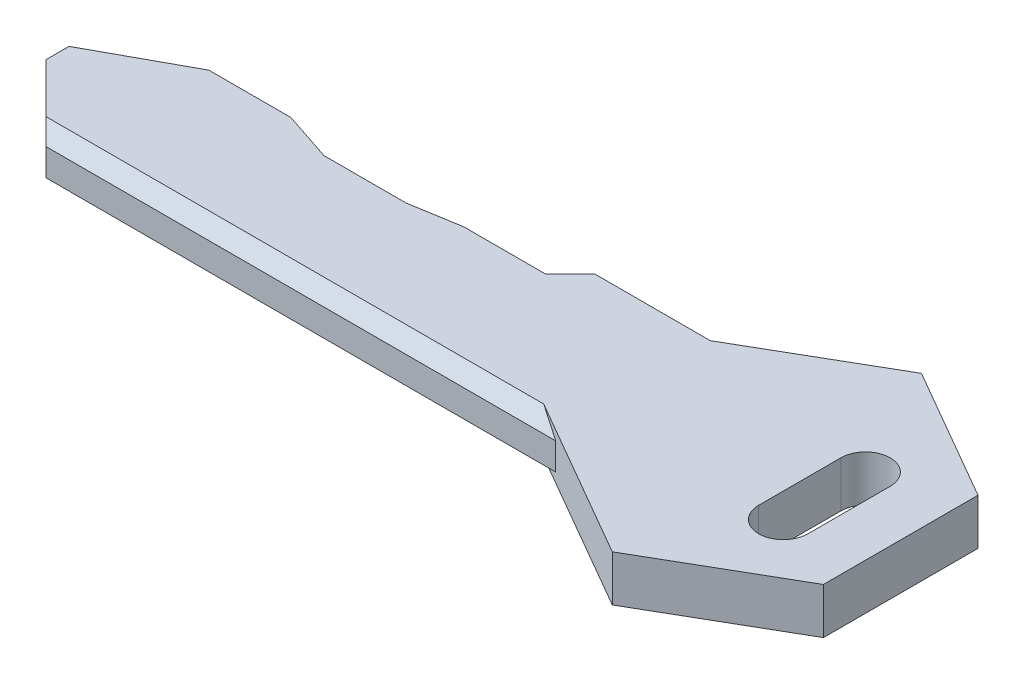
ISO-10303-21;
HEADER;
FILE_DESCRIPTION(('STEP AP214'),'2;1');
FILE_NAME('part.step','',(''),(''),'','','');
FILE_SCHEMA(('AUTOMOTIVE_DESIGN { 1 0 10303 214 1 1 1 1 }'));
ENDSEC;
DATA;
#1=APPLICATION_CONTEXT('core data for automotive mechanical design processes');
#2=APPLICATION_PROTOCOL_DEFINITION('international standard','automotive_design',2000,#1);
#3=PRODUCT_CONTEXT('',#1,'mechanical');
#4=PRODUCT('Part','Part','',(#3));
#5=PRODUCT_RELATED_PRODUCT_CATEGORY('part','',(#4));
#6=PRODUCT_DEFINITION_FORMATION('','',#4);
#7=PRODUCT_DEFINITION_CONTEXT('part definition',#1,'design');
#8=PRODUCT_DEFINITION('design','',#6,#7);
#9=PRODUCT_DEFINITION_SHAPE('','',#8);
#10=(LENGTH_UNIT() NAMED_UNIT(*) SI_UNIT(.MILLI.,.METRE.));
#11=(NAMED_UNIT(*) PLANE_ANGLE_UNIT() SI_UNIT($,.RADIAN.));
#12=(NAMED_UNIT(*) SI_UNIT($,.STERADIAN.) SOLID_ANGLE_UNIT());
#13=UNCERTAINTY_MEASURE_WITH_UNIT(LENGTH_MEASURE(1.E-05),#10,'distance_accuracy_value','');
#14=(GEOMETRIC_REPRESENTATION_CONTEXT(3) GLOBAL_UNCERTAINTY_ASSIGNED_CONTEXT((#13)) GLOBAL_UNIT_ASSIGNED_CONTEXT((#10,
#11,#12)) REPRESENTATION_CONTEXT('',''));
#15=CARTESIAN_POINT('',(0.,0.,0.));
#16=DIRECTION('',(0.,0.,1.));
#17=DIRECTION('',(1.,0.,0.));
#18=AXIS2_PLACEMENT_3D('',#15,#16,#17);
#19=CARTESIAN_POINT('',(46.6406387955737,2.8,-2.2));
#20=DIRECTION('',(0.,-1.,0.));
#21=DIRECTION('',(0.,0.,-1.));
#22=AXIS2_PLACEMENT_3D('',#19,#20,#21);
#23=CYLINDRICAL_SURFACE('',#22,1.5);
#24=CARTESIAN_POINT('',(46.6406387955737,0.,-2.2));
#25=DIRECTION('',(0.,1.,0.));
#26=DIRECTION('',(0.,0.,1.));
#27=AXIS2_PLACEMENT_3D('',#24,#25,#26);
#28=CIRCLE('',#27,1.5);
#29=CARTESIAN_POINT('',(45.1406387955737,0.,-2.2));
#30=VERTEX_POINT('',#29);
#31=CARTESIAN_POINT('',(48.1406387955737,0.,-2.2));
#32=VERTEX_POINT('',#31);
#33=EDGE_CURVE('E332',#30,#32,#28,.T.);
#34=ORIENTED_EDGE('',*,*,#33,.F.);
#35=DIRECTION('',(0.,-1.,0.));
#36=VECTOR('',#35,1.);
#37=CARTESIAN_POINT('',(45.1406387955737,2.8,-2.2));
#38=LINE('',#37,#36);
#39=CARTESIAN_POINT('',(45.1406387955737,2.8,-2.2));
#40=VERTEX_POINT('',#39);
#41=EDGE_CURVE('E350',#40,#30,#38,.T.);
#42=ORIENTED_EDGE('',*,*,#41,.F.);
#43=CARTESIAN_POINT('',(46.6406387955737,2.8,-2.2));
#44=DIRECTION('',(0.,1.,0.));
#45=DIRECTION('',(0.,0.,1.));
#46=AXIS2_PLACEMENT_3D('',#43,#44,#45);
#47=CIRCLE('',#46,1.5);
#48=CARTESIAN_POINT('',(48.1406387955737,2.8,-2.2));
#49=VERTEX_POINT('',#48);
#50=EDGE_CURVE('E308',#40,#49,#47,.T.);
#51=ORIENTED_EDGE('',*,*,#50,.T.);
#52=DIRECTION('',(0.,-1.,0.));
#53=VECTOR('',#52,1.);
#54=CARTESIAN_POINT('',(48.1406387955737,2.8,-2.2));
#55=LINE('',#54,#53);
#56=EDGE_CURVE('E343',#49,#32,#55,.T.);
#57=ORIENTED_EDGE('',*,*,#56,.T.);
#58=EDGE_LOOP('',(#34,#42,#51,#57));
#59=FACE_BOUND('',#58,.T.);
#60=ADVANCED_FACE('F34',(#59),#23,.F.);
#61=CARTESIAN_POINT('',(45.1406387955737,2.8,0.));
#62=DIRECTION('',(1.,0.,0.));
#63=DIRECTION('',(0.,0.,-1.));
#64=AXIS2_PLACEMENT_3D('',#61,#62,#63);
#65=PLANE('',#64);
#66=DIRECTION('',(0.,0.,1.));
#67=VECTOR('',#66,1.);
#68=CARTESIAN_POINT('',(45.1406387955737,0.,0.));
#69=LINE('',#68,#67);
#70=CARTESIAN_POINT('',(45.1406387955737,0.,-7.2));
#71=VERTEX_POINT('',#70);
#72=EDGE_CURVE('E335',#71,#30,#69,.T.);
#73=ORIENTED_EDGE('',*,*,#72,.F.);
#74=DIRECTION('',(0.,-1.,0.));
#75=VECTOR('',#74,1.);
#76=CARTESIAN_POINT('',(45.1406387955737,2.8,-7.2));
#77=LINE('',#76,#75);
#78=CARTESIAN_POINT('',(45.1406387955737,2.8,-7.2));
#79=VERTEX_POINT('',#78);
#80=EDGE_CURVE('E348',#79,#71,#77,.T.);
#81=ORIENTED_EDGE('',*,*,#80,.F.);
#82=DIRECTION('',(0.,0.,1.));
#83=VECTOR('',#82,1.);
#84=CARTESIAN_POINT('',(45.1406387955737,2.8,0.));
#85=LINE('',#84,#83);
#86=EDGE_CURVE('E311',#79,#40,#85,.T.);
#87=ORIENTED_EDGE('',*,*,#86,.T.);
#88=ORIENTED_EDGE('',*,*,#41,.T.);
#89=EDGE_LOOP('',(#73,#81,#87,#88));
#90=FACE_BOUND('',#89,.T.);
#91=ADVANCED_FACE('F488',(#90),#65,.T.);
#92=CARTESIAN_POINT('',(46.6406387955737,2.8,-7.2));
#93=DIRECTION('',(0.,-1.,0.));
#94=DIRECTION('',(0.,0.,-1.));
#95=AXIS2_PLACEMENT_3D('',#92,#93,#94);
#96=CYLINDRICAL_SURFACE('',#95,1.5);
#97=CARTESIAN_POINT('',(46.6406387955737,0.,-7.2));
#98=DIRECTION('',(0.,1.,0.));
#99=DIRECTION('',(0.,0.,1.));
#100=AXIS2_PLACEMENT_3D('',#97,#98,#99);
#101=CIRCLE('',#100,1.5);
#102=CARTESIAN_POINT('',(48.1406387955737,0.,-7.2));
#103=VERTEX_POINT('',#102);
#104=EDGE_CURVE('E338',#103,#71,#101,.T.);
#105=ORIENTED_EDGE('',*,*,#104,.F.);
#106=DIRECTION('',(0.,-1.,0.));
#107=VECTOR('',#106,1.);
#108=CARTESIAN_POINT('',(48.1406387955737,2.8,-7.2));
#109=LINE('',#108,#107);
#110=CARTESIAN_POINT('',(48.1406387955737,2.8,-7.2));
#111=VERTEX_POINT('',#110);
#112=EDGE_CURVE('E345',#111,#103,#109,.T.);
#113=ORIENTED_EDGE('',*,*,#112,.F.);
#114=CARTESIAN_POINT('',(46.6406387955737,2.8,-7.2));
#115=DIRECTION('',(0.,1.,0.));
#116=DIRECTION('',(0.,0.,1.));
#117=AXIS2_PLACEMENT_3D('',#114,#115,#116);
#118=CIRCLE('',#117,1.5);
#119=EDGE_CURVE('E314',#111,#79,#118,.T.);
#120=ORIENTED_EDGE('',*,*,#119,.T.);
#121=ORIENTED_EDGE('',*,*,#80,.T.);
#122=EDGE_LOOP('',(#105,#113,#120,#121));
#123=FACE_BOUND('',#122,.T.);
#124=ADVANCED_FACE('F494',(#123),#96,.F.);
#125=CARTESIAN_POINT('',(0.,2.8,0.));
#126=DIRECTION('',(0.,0.,-1.));
#127=DIRECTION('',(-1.,0.,0.));
#128=AXIS2_PLACEMENT_3D('',#125,#126,#127);
#129=PLANE('',#128);
#130=DIRECTION('',(0.,-1.,0.));
#131=VECTOR('',#130,1.);
#132=CARTESIAN_POINT('',(35.,2.8,0.));
#133=LINE('',#132,#131);
#134=CARTESIAN_POINT('',(35.,2.22264973081037,0.));
#135=VERTEX_POINT('',#134);
#136=CARTESIAN_POINT('',(35.,0.577350269189626,0.));
#137=VERTEX_POINT('',#136);
#138=EDGE_CURVE('E346',#135,#137,#133,.T.);
#139=ORIENTED_EDGE('',*,*,#138,.F.);
#140=DIRECTION('',(-1.,0.,0.));
#141=VECTOR('',#140,1.);
#142=CARTESIAN_POINT('',(4.00000000000007,2.22264973081037,0.));
#143=LINE('',#142,#141);
#144=CARTESIAN_POINT('',(4.00000000000007,2.22264973081037,0.));
#145=VERTEX_POINT('',#144);
#146=EDGE_CURVE('E394',#135,#145,#143,.T.);
#147=ORIENTED_EDGE('',*,*,#146,.T.);
#148=DIRECTION('',(0.,-1.,0.));
#149=VECTOR('',#148,1.);
#150=CARTESIAN_POINT('',(4.00000000000007,0.,0.));
#151=LINE('',#150,#149);
#152=CARTESIAN_POINT('',(4.00000000000007,0.577350269189626,0.));
#153=VERTEX_POINT('',#152);
#154=EDGE_CURVE('E352',#145,#153,#151,.T.);
#155=ORIENTED_EDGE('',*,*,#154,.T.);
#156=DIRECTION('',(1.,0.,0.));
#157=VECTOR('',#156,1.);
#158=CARTESIAN_POINT('',(0.,0.577350269189626,0.));
#159=LINE('',#158,#157);
#160=EDGE_CURVE('E380',#153,#137,#159,.T.);
#161=ORIENTED_EDGE('',*,*,#160,.T.);
#162=EDGE_LOOP('',(#139,#147,#155,#161));
#163=FACE_BOUND('',#162,.T.);
#164=ADVANCED_FACE('F517',(#163),#129,.F.);
#165=CARTESIAN_POINT('',(8.75,2.8,-15.1554445662277));
#166=DIRECTION('',(0.5,0.,-0.866025403784439));
#167=DIRECTION('',(-0.866025403784439,0.,-0.5));
#168=AXIS2_PLACEMENT_3D('',#165,#166,#167);
#169=PLANE('',#168);
#170=DIRECTION('',(0.866025403784439,0.,0.5));
#171=VECTOR('',#170,1.);
#172=CARTESIAN_POINT('',(8.75,0.,-15.1554445662277));
#173=LINE('',#172,#171);
#174=CARTESIAN_POINT('',(33.2679491924311,0.,-1.00000000000001));
#175=VERTEX_POINT('',#174);
#176=CARTESIAN_POINT('',(43.1406387955737,0.,4.7));
#177=VERTEX_POINT('',#176);
#178=EDGE_CURVE('E282',#175,#177,#173,.T.);
#179=ORIENTED_EDGE('',*,*,#178,.T.);
#180=DIRECTION('',(0.,-1.,0.));
#181=VECTOR('',#180,1.);
#182=CARTESIAN_POINT('',(43.1406387955737,2.8,4.7));
#183=LINE('',#182,#181);
#184=CARTESIAN_POINT('',(43.1406387955737,2.8,4.7));
#185=VERTEX_POINT('',#184);
#186=EDGE_CURVE('E364',#185,#177,#183,.T.);
#187=ORIENTED_EDGE('',*,*,#186,.F.);
#188=DIRECTION('',(0.866025403784439,0.,0.5));
#189=VECTOR('',#188,1.);
#190=CARTESIAN_POINT('',(8.75,2.8,-15.1554445662277));
#191=LINE('',#190,#189);
#192=CARTESIAN_POINT('',(33.2679491924311,2.8,-1.));
#193=VERTEX_POINT('',#192);
#194=EDGE_CURVE('E291',#193,#185,#191,.T.);
#195=ORIENTED_EDGE('',*,*,#194,.F.);
#196=DIRECTION('',(0.832050294337844,-0.277350098112613,0.480384461415262));
#197=VECTOR('',#196,1.);
#198=CARTESIAN_POINT('',(10.6359960917254,10.3439843669018,-14.0665642149794));
#199=LINE('',#198,#197);
#200=EDGE_CURVE('E57',#193,#135,#199,.T.);
#201=ORIENTED_EDGE('',*,*,#200,.T.);
#202=ORIENTED_EDGE('',*,*,#138,.T.);
#203=DIRECTION('',(0.832050294337844,0.277350098112613,0.480384461415262));
#204=VECTOR('',#203,1.);
#205=CARTESIAN_POINT('',(11.2821499378793,-7.32859975151722,-13.6935071179646));
#206=LINE('',#205,#204);
#207=EDGE_CURVE('E388',#137,#175,#206,.F.);
#208=ORIENTED_EDGE('',*,*,#207,.T.);
#209=EDGE_LOOP('',(#179,#187,#195,#201,#202,#208));
#210=FACE_BOUND('',#209,.T.);
#211=ADVANCED_FACE('F449',(#210),#169,.F.);
#212=CARTESIAN_POINT('',(12.8203193977869,2.8,22.2054445662277));
#213=DIRECTION('',(-0.5,0.,-0.866025403784439));
#214=DIRECTION('',(-0.866025403784438,0.,0.5));
#215=AXIS2_PLACEMENT_3D('',#212,#213,#214);
#216=PLANE('',#215);
#217=DIRECTION('',(0.866025403784439,0.,-0.5));
#218=VECTOR('',#217,1.);
#219=CARTESIAN_POINT('',(12.8203193977869,0.,22.2054445662277));
#220=LINE('',#219,#218);
#221=CARTESIAN_POINT('',(51.2812775911475,0.,0.));
#222=VERTEX_POINT('',#221);
#223=EDGE_CURVE('E321',#177,#222,#220,.T.);
#224=ORIENTED_EDGE('',*,*,#223,.T.);
#225=DIRECTION('',(0.,-1.,0.));
#226=VECTOR('',#225,1.);
#227=CARTESIAN_POINT('',(51.2812775911475,2.8,0.));
#228=LINE('',#227,#226);
#229=CARTESIAN_POINT('',(51.2812775911475,2.8,0.));
#230=VERTEX_POINT('',#229);
#231=EDGE_CURVE('E361',#230,#222,#228,.T.);
#232=ORIENTED_EDGE('',*,*,#231,.F.);
#233=DIRECTION('',(0.866025403784439,0.,-0.5));
#234=VECTOR('',#233,1.);
#235=CARTESIAN_POINT('',(12.8203193977869,2.8,22.2054445662277));
#236=LINE('',#235,#234);
#237=EDGE_CURVE('E293',#185,#230,#236,.T.);
#238=ORIENTED_EDGE('',*,*,#237,.F.);
#239=ORIENTED_EDGE('',*,*,#186,.T.);
#240=EDGE_LOOP('',(#224,#232,#238,#239));
#241=FACE_BOUND('',#240,.T.);
#242=ADVANCED_FACE('F446',(#241),#216,.F.);
#243=CARTESIAN_POINT('',(51.2812775911475,2.8,0.));
#244=DIRECTION('',(-1.,0.,0.));
#245=DIRECTION('',(0.,0.,1.));
#246=AXIS2_PLACEMENT_3D('',#243,#244,#245);
#247=PLANE('',#246);
#248=DIRECTION('',(0.,0.,-1.));
#249=VECTOR('',#248,1.);
#250=CARTESIAN_POINT('',(51.2812775911475,0.,0.));
#251=LINE('',#250,#249);
#252=CARTESIAN_POINT('',(51.2812775911475,0.,-9.40000000000001));
#253=VERTEX_POINT('',#252);
#254=EDGE_CURVE('E323',#222,#253,#251,.T.);
#255=ORIENTED_EDGE('',*,*,#254,.T.);
#256=DIRECTION('',(0.,-1.,0.));
#257=VECTOR('',#256,1.);
#258=CARTESIAN_POINT('',(51.2812775911475,2.8,-9.40000000000001));
#259=LINE('',#258,#257);
#260=CARTESIAN_POINT('',(51.2812775911475,2.8,-9.40000000000001));
#261=VERTEX_POINT('',#260);
#262=EDGE_CURVE('E358',#261,#253,#259,.T.);
#263=ORIENTED_EDGE('',*,*,#262,.F.);
#264=DIRECTION('',(0.,0.,-1.));
#265=VECTOR('',#264,1.);
#266=CARTESIAN_POINT('',(51.2812775911475,2.8,0.));
#267=LINE('',#266,#265);
#268=EDGE_CURVE('E296',#230,#261,#267,.T.);
#269=ORIENTED_EDGE('',*,*,#268,.F.);
#270=ORIENTED_EDGE('',*,*,#231,.T.);
#271=EDGE_LOOP('',(#255,#263,#269,#270));
#272=FACE_BOUND('',#271,.T.);
#273=ADVANCED_FACE('F442',(#272),#247,.F.);
#274=CARTESIAN_POINT('',(16.8906387955737,2.8,-29.2554445662277));
#275=DIRECTION('',(-0.5,0.,0.866025403784439));
#276=DIRECTION('',(0.866025403784439,0.,0.5));
#277=AXIS2_PLACEMENT_3D('',#274,#275,#276);
#278=PLANE('',#277);
#279=DIRECTION('',(-0.866025403784439,0.,-0.5));
#280=VECTOR('',#279,1.);
#281=CARTESIAN_POINT('',(16.8906387955737,0.,-29.2554445662277));
#282=LINE('',#281,#280);
#283=CARTESIAN_POINT('',(43.1406387955737,0.,-14.1));
#284=VERTEX_POINT('',#283);
#285=EDGE_CURVE('E325',#253,#284,#282,.T.);
#286=ORIENTED_EDGE('',*,*,#285,.T.);
#287=DIRECTION('',(0.,-1.,0.));
#288=VECTOR('',#287,1.);
#289=CARTESIAN_POINT('',(43.1406387955737,2.8,-14.1));
#290=LINE('',#289,#288);
#291=CARTESIAN_POINT('',(43.1406387955737,2.8,-14.1));
#292=VERTEX_POINT('',#291);
#293=EDGE_CURVE('E355',#292,#284,#290,.T.);
#294=ORIENTED_EDGE('',*,*,#293,.F.);
#295=DIRECTION('',(-0.866025403784439,0.,-0.5));
#296=VECTOR('',#295,1.);
#297=CARTESIAN_POINT('',(16.8906387955737,2.8,-29.2554445662277));
#298=LINE('',#297,#296);
#299=EDGE_CURVE('E298',#261,#292,#298,.T.);
#300=ORIENTED_EDGE('',*,*,#299,.F.);
#301=ORIENTED_EDGE('',*,*,#262,.T.);
#302=EDGE_LOOP('',(#286,#294,#300,#301));
#303=FACE_BOUND('',#302,.T.);
#304=ADVANCED_FACE('F438',(#303),#278,.F.);
#305=CARTESIAN_POINT('',(4.67968060221315,2.8,8.10544456622769));
#306=DIRECTION('',(0.5,0.,0.866025403784438));
#307=DIRECTION('',(0.866025403784438,0.,-0.5));
#308=AXIS2_PLACEMENT_3D('',#305,#306,#307);
#309=PLANE('',#308);
#310=DIRECTION('',(-0.866025403784438,0.,0.5));
#311=VECTOR('',#310,1.);
#312=CARTESIAN_POINT('',(4.67968060221315,0.,8.10544456622769));
#313=LINE('',#312,#311);
#314=CARTESIAN_POINT('',(35.,0.,-9.4));
#315=VERTEX_POINT('',#314);
#316=EDGE_CURVE('E327',#284,#315,#313,.T.);
#317=ORIENTED_EDGE('',*,*,#316,.T.);
#318=DIRECTION('',(0.,-1.,0.));
#319=VECTOR('',#318,1.);
#320=CARTESIAN_POINT('',(35.,2.8,-9.4));
#321=LINE('',#320,#319);
#322=CARTESIAN_POINT('',(35.,2.8,-9.4));
#323=VERTEX_POINT('',#322);
#324=EDGE_CURVE('E319',#323,#315,#321,.T.);
#325=ORIENTED_EDGE('',*,*,#324,.F.);
#326=DIRECTION('',(-0.866025403784438,0.,0.5));
#327=VECTOR('',#326,1.);
#328=CARTESIAN_POINT('',(4.67968060221315,2.8,8.10544456622769));
#329=LINE('',#328,#327);
#330=EDGE_CURVE('E300',#292,#323,#329,.T.);
#331=ORIENTED_EDGE('',*,*,#330,.F.);
#332=ORIENTED_EDGE('',*,*,#293,.T.);
#333=EDGE_LOOP('',(#317,#325,#331,#332));
#334=FACE_BOUND('',#333,.T.);
#335=ADVANCED_FACE('F433',(#334),#309,.F.);
#336=CARTESIAN_POINT('',(0.,2.8,-9.4));
#337=DIRECTION('',(0.,0.,-1.));
#338=DIRECTION('',(-1.,0.,0.));
#339=AXIS2_PLACEMENT_3D('',#336,#337,#338);
#340=PLANE('',#339);
#341=DIRECTION('',(0.,1.,0.));
#342=VECTOR('',#341,1.);
#343=CARTESIAN_POINT('',(28.,-7.2,-9.4));
#344=LINE('',#343,#342);
#345=CARTESIAN_POINT('',(28.,0.,-9.4));
#346=VERTEX_POINT('',#345);
#347=CARTESIAN_POINT('',(28.,2.8,-9.4));
#348=VERTEX_POINT('',#347);
#349=EDGE_CURVE('E250',#346,#348,#344,.T.);
#350=ORIENTED_EDGE('',*,*,#349,.T.);
#351=DIRECTION('',(1.,0.,0.));
#352=VECTOR('',#351,1.);
#353=CARTESIAN_POINT('',(0.,2.8,-9.4));
#354=LINE('',#353,#352);
#355=EDGE_CURVE('E303',#348,#323,#354,.T.);
#356=ORIENTED_EDGE('',*,*,#355,.T.);
#357=ORIENTED_EDGE('',*,*,#324,.T.);
#358=DIRECTION('',(1.,0.,0.));
#359=VECTOR('',#358,1.);
#360=CARTESIAN_POINT('',(0.,0.,-9.4));
#361=LINE('',#360,#359);
#362=EDGE_CURVE('E330',#346,#315,#361,.T.);
#363=ORIENTED_EDGE('',*,*,#362,.F.);
#364=EDGE_LOOP('',(#350,#356,#357,#363));
#365=FACE_BOUND('',#364,.T.);
#366=ADVANCED_FACE('F427',(#365),#340,.T.);
#367=CARTESIAN_POINT('',(0.,2.8,0.));
#368=DIRECTION('',(-1.,0.,0.));
#369=DIRECTION('',(0.,0.,1.));
#370=AXIS2_PLACEMENT_3D('',#367,#368,#369);
#371=PLANE('',#370);
#372=DIRECTION('',(0.,1.,0.));
#373=VECTOR('',#372,1.);
#374=CARTESIAN_POINT('',(0.,-7.2,-5.4));
#375=LINE('',#374,#373);
#376=CARTESIAN_POINT('',(0.,1.6,-5.4));
#377=VERTEX_POINT('',#376);
#378=CARTESIAN_POINT('',(0.,2.8,-5.4));
#379=VERTEX_POINT('',#378);
#380=EDGE_CURVE('E248',#377,#379,#375,.T.);
#381=ORIENTED_EDGE('',*,*,#380,.F.);
#382=DIRECTION('',(0.,0.,-1.));
#383=VECTOR('',#382,1.);
#384=CARTESIAN_POINT('',(0.,1.6,-6.));
#385=LINE('',#384,#383);
#386=CARTESIAN_POINT('',(0.,1.6,-4.00000000000003));
#387=VERTEX_POINT('',#386);
#388=EDGE_CURVE('E264',#387,#377,#385,.T.);
#389=ORIENTED_EDGE('',*,*,#388,.F.);
#390=DIRECTION('',(0.,1.,0.));
#391=VECTOR('',#390,1.);
#392=CARTESIAN_POINT('',(0.,2.8,-4.00000000000003));
#393=LINE('',#392,#391);
#394=CARTESIAN_POINT('',(0.,2.8,-4.00000000000003));
#395=VERTEX_POINT('',#394);
#396=EDGE_CURVE('E375',#387,#395,#393,.T.);
#397=ORIENTED_EDGE('',*,*,#396,.T.);
#398=DIRECTION('',(0.,0.,-1.));
#399=VECTOR('',#398,1.);
#400=CARTESIAN_POINT('',(0.,2.8,0.));
#401=LINE('',#400,#399);
#402=EDGE_CURVE('E305',#395,#379,#401,.T.);
#403=ORIENTED_EDGE('',*,*,#402,.T.);
#404=EDGE_LOOP('',(#381,#389,#397,#403));
#405=FACE_BOUND('',#404,.T.);
#406=ADVANCED_FACE('F500',(#405),#371,.T.);
#407=CARTESIAN_POINT('',(48.1406387955737,2.8,0.));
#408=DIRECTION('',(1.,0.,0.));
#409=DIRECTION('',(0.,0.,-1.));
#410=AXIS2_PLACEMENT_3D('',#407,#408,#409);
#411=PLANE('',#410);
#412=DIRECTION('',(0.,0.,1.));
#413=VECTOR('',#412,1.);
#414=CARTESIAN_POINT('',(48.1406387955737,0.,0.));
#415=LINE('',#414,#413);
#416=EDGE_CURVE('E294',#103,#32,#415,.T.);
#417=ORIENTED_EDGE('',*,*,#416,.T.);
#418=ORIENTED_EDGE('',*,*,#56,.F.);
#419=DIRECTION('',(0.,0.,1.));
#420=VECTOR('',#419,1.);
#421=CARTESIAN_POINT('',(48.1406387955737,2.8,0.));
#422=LINE('',#421,#420);
#423=EDGE_CURVE('E317',#111,#49,#422,.T.);
#424=ORIENTED_EDGE('',*,*,#423,.F.);
#425=ORIENTED_EDGE('',*,*,#112,.T.);
#426=EDGE_LOOP('',(#417,#418,#424,#425));
#427=FACE_BOUND('',#426,.T.);
#428=ADVANCED_FACE('F503',(#427),#411,.F.);
#429=CARTESIAN_POINT('',(0.,2.8,0.));
#430=DIRECTION('',(0.,1.,0.));
#431=DIRECTION('',(0.,0.,1.));
#432=AXIS2_PLACEMENT_3D('',#429,#430,#431);
#433=PLANE('',#432);
#434=DIRECTION('',(0.877895572914385,0.,-0.478852130680573));
#435=VECTOR('',#434,1.);
#436=CARTESIAN_POINT('',(5.50000000000001,2.8,-8.4));
#437=LINE('',#436,#435);
#438=CARTESIAN_POINT('',(5.50000000000001,2.8,-8.4));
#439=VERTEX_POINT('',#438);
#440=EDGE_CURVE('E219',#379,#439,#437,.T.);
#441=ORIENTED_EDGE('',*,*,#440,.F.);
#442=ORIENTED_EDGE('',*,*,#402,.F.);
#443=DIRECTION('',(0.707106781186551,0.,0.707106781186544));
#444=VECTOR('',#443,1.);
#445=CARTESIAN_POINT('',(2.00000000000001,2.8,-2.00000000000004));
#446=LINE('',#445,#444);
#447=CARTESIAN_POINT('',(3.00000000000005,2.8,-1.00000000000001));
#448=VERTEX_POINT('',#447);
#449=EDGE_CURVE('E377',#395,#448,#446,.T.);
#450=ORIENTED_EDGE('',*,*,#449,.T.);
#451=DIRECTION('',(1.,0.,0.));
#452=VECTOR('',#451,1.);
#453=CARTESIAN_POINT('',(35.,2.8,-1.00000000000001));
#454=LINE('',#453,#452);
#455=EDGE_CURVE('E391',#448,#193,#454,.T.);
#456=ORIENTED_EDGE('',*,*,#455,.T.);
#457=ORIENTED_EDGE('',*,*,#194,.T.);
#458=ORIENTED_EDGE('',*,*,#237,.T.);
#459=ORIENTED_EDGE('',*,*,#268,.T.);
#460=ORIENTED_EDGE('',*,*,#299,.T.);
#461=ORIENTED_EDGE('',*,*,#330,.T.);
#462=ORIENTED_EDGE('',*,*,#355,.F.);
#463=DIRECTION('',(0.707106781186548,0.,-0.707106781186547));
#464=VECTOR('',#463,1.);
#465=CARTESIAN_POINT('',(26.5,2.8,-7.9));
#466=LINE('',#465,#464);
#467=CARTESIAN_POINT('',(26.5,2.8,-7.9));
#468=VERTEX_POINT('',#467);
#469=EDGE_CURVE('E244',#468,#348,#466,.T.);
#470=ORIENTED_EDGE('',*,*,#469,.F.);
#471=DIRECTION('',(1.,0.,0.));
#472=VECTOR('',#471,1.);
#473=CARTESIAN_POINT('',(24.,2.8,-7.9));
#474=LINE('',#473,#472);
#475=CARTESIAN_POINT('',(21.5,2.8,-7.9));
#476=VERTEX_POINT('',#475);
#477=EDGE_CURVE('E241',#476,#468,#474,.T.);
#478=ORIENTED_EDGE('',*,*,#477,.F.);
#479=DIRECTION('',(0.986393923832144,0.,-0.164398987305358));
#480=VECTOR('',#479,1.);
#481=CARTESIAN_POINT('',(21.5,2.8,-7.9));
#482=LINE('',#481,#480);
#483=CARTESIAN_POINT('',(18.5,2.8,-7.4));
#484=VERTEX_POINT('',#483);
#485=EDGE_CURVE('E236',#484,#476,#482,.T.);
#486=ORIENTED_EDGE('',*,*,#485,.F.);
#487=DIRECTION('',(1.,0.,0.));
#488=VECTOR('',#487,1.);
#489=CARTESIAN_POINT('',(16.,2.8,-7.4));
#490=LINE('',#489,#488);
#491=CARTESIAN_POINT('',(13.5,2.8,-7.4));
#492=VERTEX_POINT('',#491);
#493=EDGE_CURVE('E234',#492,#484,#490,.T.);
#494=ORIENTED_EDGE('',*,*,#493,.F.);
#495=DIRECTION('',(0.948683298050514,0.,0.316227766016837));
#496=VECTOR('',#495,1.);
#497=CARTESIAN_POINT('',(10.5,2.8,-8.4));
#498=LINE('',#497,#496);
#499=CARTESIAN_POINT('',(10.5,2.8,-8.4));
#500=VERTEX_POINT('',#499);
#501=EDGE_CURVE('E212',#500,#492,#498,.T.);
#502=ORIENTED_EDGE('',*,*,#501,.F.);
#503=DIRECTION('',(1.,0.,0.));
#504=VECTOR('',#503,1.);
#505=CARTESIAN_POINT('',(8.,2.8,-8.4));
#506=LINE('',#505,#504);
#507=EDGE_CURVE('E222',#439,#500,#506,.T.);
#508=ORIENTED_EDGE('',*,*,#507,.F.);
#509=EDGE_LOOP('',(#441,#442,#450,#456,#457,#458,#459,#460,#461,#462,#470,#478,#486,#494,#502,#508));
#510=FACE_BOUND('',#509,.T.);
#511=ORIENTED_EDGE('',*,*,#50,.F.);
#512=ORIENTED_EDGE('',*,*,#86,.F.);
#513=ORIENTED_EDGE('',*,*,#119,.F.);
#514=ORIENTED_EDGE('',*,*,#423,.T.);
#515=EDGE_LOOP('',(#511,#512,#513,#514));
#516=FACE_BOUND('',#515,.T.);
#517=ADVANCED_FACE('F230',(#510,#516),#433,.T.);
#518=CARTESIAN_POINT('',(0.,0.,0.));
#519=DIRECTION('',(0.,1.,0.));
#520=DIRECTION('',(0.,0.,1.));
#521=AXIS2_PLACEMENT_3D('',#518,#519,#520);
#522=PLANE('',#521);
#523=DIRECTION('',(-1.,0.,0.));
#524=VECTOR('',#523,1.);
#525=CARTESIAN_POINT('',(35.,0.,-6.));
#526=LINE('',#525,#524);
#527=CARTESIAN_POINT('',(35.,0.,-6.));
#528=VERTEX_POINT('',#527);
#529=CARTESIAN_POINT('',(1.1,0.,-6.));
#530=VERTEX_POINT('',#529);
#531=EDGE_CURVE('E276',#528,#530,#526,.T.);
#532=ORIENTED_EDGE('',*,*,#531,.T.);
#533=DIRECTION('',(0.877895572914385,0.,-0.478852130680573));
#534=VECTOR('',#533,1.);
#535=CARTESIAN_POINT('',(-2.27006369426751,0.,-4.16178343949045));
#536=LINE('',#535,#534);
#537=CARTESIAN_POINT('',(5.50000000000001,0.,-8.4));
#538=VERTEX_POINT('',#537);
#539=EDGE_CURVE('E261',#530,#538,#536,.T.);
#540=ORIENTED_EDGE('',*,*,#539,.T.);
#541=DIRECTION('',(1.,0.,0.));
#542=VECTOR('',#541,1.);
#543=CARTESIAN_POINT('',(0.,0.,-8.4));
#544=LINE('',#543,#542);
#545=CARTESIAN_POINT('',(10.5,0.,-8.4));
#546=VERTEX_POINT('',#545);
#547=EDGE_CURVE('E401',#538,#546,#544,.T.);
#548=ORIENTED_EDGE('',*,*,#547,.T.);
#549=DIRECTION('',(0.948683298050514,0.,0.316227766016837));
#550=VECTOR('',#549,1.);
#551=CARTESIAN_POINT('',(3.56999999999999,0.,-10.71));
#552=LINE('',#551,#550);
#553=CARTESIAN_POINT('',(13.5,0.,-7.4));
#554=VERTEX_POINT('',#553);
#555=EDGE_CURVE('E215',#546,#554,#552,.T.);
#556=ORIENTED_EDGE('',*,*,#555,.T.);
#557=DIRECTION('',(1.,0.,0.));
#558=VECTOR('',#557,1.);
#559=CARTESIAN_POINT('',(0.,0.,-7.40000000000001));
#560=LINE('',#559,#558);
#561=CARTESIAN_POINT('',(18.5,0.,-7.4));
#562=VERTEX_POINT('',#561);
#563=EDGE_CURVE('E404',#554,#562,#560,.T.);
#564=ORIENTED_EDGE('',*,*,#563,.T.);
#565=DIRECTION('',(0.986393923832144,0.,-0.164398987305358));
#566=VECTOR('',#565,1.);
#567=CARTESIAN_POINT('',(-0.7,0.,-4.19999999999999));
#568=LINE('',#567,#566);
#569=CARTESIAN_POINT('',(21.5,0.,-7.9));
#570=VERTEX_POINT('',#569);
#571=EDGE_CURVE('E407',#562,#570,#568,.T.);
#572=ORIENTED_EDGE('',*,*,#571,.T.);
#573=DIRECTION('',(1.,0.,0.));
#574=VECTOR('',#573,1.);
#575=CARTESIAN_POINT('',(0.,0.,-7.90000000000002));
#576=LINE('',#575,#574);
#577=CARTESIAN_POINT('',(26.5,0.,-7.9));
#578=VERTEX_POINT('',#577);
#579=EDGE_CURVE('E42',#570,#578,#576,.T.);
#580=ORIENTED_EDGE('',*,*,#579,.T.);
#581=DIRECTION('',(0.707106781186548,0.,-0.707106781186547));
#582=VECTOR('',#581,1.);
#583=CARTESIAN_POINT('',(9.29999999999999,0.,9.3));
#584=LINE('',#583,#582);
#585=EDGE_CURVE('E11',#578,#346,#584,.T.);
#586=ORIENTED_EDGE('',*,*,#585,.T.);
#587=ORIENTED_EDGE('',*,*,#362,.T.);
#588=ORIENTED_EDGE('',*,*,#316,.F.);
#589=ORIENTED_EDGE('',*,*,#285,.F.);
#590=ORIENTED_EDGE('',*,*,#254,.F.);
#591=ORIENTED_EDGE('',*,*,#223,.F.);
#592=ORIENTED_EDGE('',*,*,#178,.F.);
#593=DIRECTION('',(-1.,0.,0.));
#594=VECTOR('',#593,1.);
#595=CARTESIAN_POINT('',(0.,0.,-1.00000000000001));
#596=LINE('',#595,#594);
#597=CARTESIAN_POINT('',(3.00000000000005,0.,-1.00000000000001));
#598=VERTEX_POINT('',#597);
#599=EDGE_CURVE('E383',#175,#598,#596,.T.);
#600=ORIENTED_EDGE('',*,*,#599,.T.);
#601=DIRECTION('',(-0.707106781186551,0.,-0.707106781186544));
#602=VECTOR('',#601,1.);
#603=CARTESIAN_POINT('',(4.00000000000007,0.,0.));
#604=LINE('',#603,#602);
#605=CARTESIAN_POINT('',(1.10000000000004,0.,-2.9));
#606=VERTEX_POINT('',#605);
#607=EDGE_CURVE('E369',#598,#606,#604,.T.);
#608=ORIENTED_EDGE('',*,*,#607,.T.);
#609=DIRECTION('',(-1.,0.,0.));
#610=VECTOR('',#609,1.);
#611=CARTESIAN_POINT('',(35.,0.,-2.9));
#612=LINE('',#611,#610);
#613=CARTESIAN_POINT('',(35.,0.,-2.9));
#614=VERTEX_POINT('',#613);
#615=EDGE_CURVE('E286',#614,#606,#612,.T.);
#616=ORIENTED_EDGE('',*,*,#615,.F.);
#617=DIRECTION('',(0.,0.,1.));
#618=VECTOR('',#617,1.);
#619=CARTESIAN_POINT('',(35.,0.,-6.));
#620=LINE('',#619,#618);
#621=EDGE_CURVE('E267',#528,#614,#620,.T.);
#622=ORIENTED_EDGE('',*,*,#621,.F.);
#623=EDGE_LOOP('',(#532,#540,#548,#556,#564,#572,#580,#586,#587,#588,#589,#590,#591,#592,#600,
#608,#616,#622));
#624=FACE_BOUND('',#623,.T.);
#625=ORIENTED_EDGE('',*,*,#33,.T.);
#626=ORIENTED_EDGE('',*,*,#416,.F.);
#627=ORIENTED_EDGE('',*,*,#104,.T.);
#628=ORIENTED_EDGE('',*,*,#72,.T.);
#629=EDGE_LOOP('',(#625,#626,#627,#628));
#630=FACE_BOUND('',#629,.T.);
#631=ADVANCED_FACE('F411',(#624,#630),#522,.F.);
#632=CARTESIAN_POINT('',(35.,0.,-6.));
#633=DIRECTION('',(0.,0.,-1.));
#634=DIRECTION('',(-1.,0.,0.));
#635=AXIS2_PLACEMENT_3D('',#632,#633,#634);
#636=PLANE('',#635);
#637=DIRECTION('',(-1.,0.,0.));
#638=VECTOR('',#637,1.);
#639=CARTESIAN_POINT('',(35.,1.6,-6.));
#640=LINE('',#639,#638);
#641=CARTESIAN_POINT('',(35.,1.6,-6.));
#642=VERTEX_POINT('',#641);
#643=CARTESIAN_POINT('',(1.1,1.6,-6.));
#644=VERTEX_POINT('',#643);
#645=EDGE_CURVE('E279',#642,#644,#640,.T.);
#646=ORIENTED_EDGE('',*,*,#645,.T.);
#647=DIRECTION('',(0.,-1.,0.));
#648=VECTOR('',#647,1.);
#649=CARTESIAN_POINT('',(1.1,0.,-6.));
#650=LINE('',#649,#648);
#651=EDGE_CURVE('E49',#644,#530,#650,.T.);
#652=ORIENTED_EDGE('',*,*,#651,.T.);
#653=ORIENTED_EDGE('',*,*,#531,.F.);
#654=DIRECTION('',(0.,-1.,0.));
#655=VECTOR('',#654,1.);
#656=CARTESIAN_POINT('',(35.,0.,-6.));
#657=LINE('',#656,#655);
#658=EDGE_CURVE('E265',#642,#528,#657,.T.);
#659=ORIENTED_EDGE('',*,*,#658,.F.);
#660=EDGE_LOOP('',(#646,#652,#653,#659));
#661=FACE_BOUND('',#660,.T.);
#662=ADVANCED_FACE('F476',(#661),#636,.F.);
#663=CARTESIAN_POINT('',(35.,1.6,-6.));
#664=DIRECTION('',(0.,1.,0.));
#665=DIRECTION('',(0.,0.,1.));
#666=AXIS2_PLACEMENT_3D('',#663,#664,#665);
#667=PLANE('',#666);
#668=ORIENTED_EDGE('',*,*,#388,.T.);
#669=DIRECTION('',(0.877895572914385,0.,-0.478852130680573));
#670=VECTOR('',#669,1.);
#671=CARTESIAN_POINT('',(27.2267515923567,1.6,-20.2509554140127));
#672=LINE('',#671,#670);
#673=EDGE_CURVE('E399',#377,#644,#672,.T.);
#674=ORIENTED_EDGE('',*,*,#673,.T.);
#675=ORIENTED_EDGE('',*,*,#645,.F.);
#676=DIRECTION('',(0.,0.,-1.));
#677=VECTOR('',#676,1.);
#678=CARTESIAN_POINT('',(35.,1.6,-6.));
#679=LINE('',#678,#677);
#680=CARTESIAN_POINT('',(35.,1.6,-2.9));
#681=VERTEX_POINT('',#680);
#682=EDGE_CURVE('E273',#681,#642,#679,.T.);
#683=ORIENTED_EDGE('',*,*,#682,.F.);
#684=DIRECTION('',(-1.,0.,0.));
#685=VECTOR('',#684,1.);
#686=CARTESIAN_POINT('',(35.,1.6,-2.9));
#687=LINE('',#686,#685);
#688=CARTESIAN_POINT('',(1.10000000000004,1.6,-2.9));
#689=VERTEX_POINT('',#688);
#690=EDGE_CURVE('E283',#681,#689,#687,.T.);
#691=ORIENTED_EDGE('',*,*,#690,.T.);
#692=DIRECTION('',(-0.707106781186551,0.,-0.707106781186544));
#693=VECTOR('',#692,1.);
#694=CARTESIAN_POINT('',(4.00000000000007,1.6,0.));
#695=LINE('',#694,#693);
#696=EDGE_CURVE('E373',#689,#387,#695,.T.);
#697=ORIENTED_EDGE('',*,*,#696,.T.);
#698=EDGE_LOOP('',(#668,#674,#675,#683,#691,#697));
#699=FACE_BOUND('',#698,.T.);
#700=ADVANCED_FACE('F468',(#699),#667,.F.);
#701=CARTESIAN_POINT('',(35.,0.,-2.9));
#702=DIRECTION('',(0.,0.,1.));
#703=DIRECTION('',(1.,0.,0.));
#704=AXIS2_PLACEMENT_3D('',#701,#702,#703);
#705=PLANE('',#704);
#706=ORIENTED_EDGE('',*,*,#615,.T.);
#707=DIRECTION('',(0.,1.,0.));
#708=VECTOR('',#707,1.);
#709=CARTESIAN_POINT('',(1.10000000000004,2.8,-2.9));
#710=LINE('',#709,#708);
#711=EDGE_CURVE('E371',#606,#689,#710,.T.);
#712=ORIENTED_EDGE('',*,*,#711,.T.);
#713=ORIENTED_EDGE('',*,*,#690,.F.);
#714=DIRECTION('',(0.,1.,0.));
#715=VECTOR('',#714,1.);
#716=CARTESIAN_POINT('',(35.,0.,-2.9));
#717=LINE('',#716,#715);
#718=EDGE_CURVE('E270',#614,#681,#717,.T.);
#719=ORIENTED_EDGE('',*,*,#718,.F.);
#720=EDGE_LOOP('',(#706,#712,#713,#719));
#721=FACE_BOUND('',#720,.T.);
#722=ADVANCED_FACE('F465',(#721),#705,.F.);
#723=CARTESIAN_POINT('',(35.,0.,0.));
#724=DIRECTION('',(1.,0.,0.));
#725=DIRECTION('',(0.,0.,-1.));
#726=AXIS2_PLACEMENT_3D('',#723,#724,#725);
#727=PLANE('',#726);
#728=ORIENTED_EDGE('',*,*,#658,.T.);
#729=ORIENTED_EDGE('',*,*,#621,.T.);
#730=ORIENTED_EDGE('',*,*,#718,.T.);
#731=ORIENTED_EDGE('',*,*,#682,.T.);
#732=EDGE_LOOP('',(#728,#729,#730,#731));
#733=FACE_BOUND('',#732,.T.);
#734=ADVANCED_FACE('F472',(#733),#727,.F.);
#735=CARTESIAN_POINT('',(4.00000000000007,2.8,0.));
#736=DIRECTION('',(-0.707106781186544,0.,0.707106781186551));
#737=DIRECTION('',(0.,1.,0.));
#738=AXIS2_PLACEMENT_3D('',#735,#736,#737);
#739=PLANE('',#738);
#740=ORIENTED_EDGE('',*,*,#154,.F.);
#741=DIRECTION('',(-0.654653670707982,0.377964473009223,-0.654653670707975));
#742=VECTOR('',#741,1.);
#743=CARTESIAN_POINT('',(3.85714285714293,2.3051283406946,-0.142857142857141));
#744=LINE('',#743,#742);
#745=EDGE_CURVE('E396',#145,#448,#744,.T.);
#746=ORIENTED_EDGE('',*,*,#745,.T.);
#747=ORIENTED_EDGE('',*,*,#449,.F.);
#748=ORIENTED_EDGE('',*,*,#396,.F.);
#749=ORIENTED_EDGE('',*,*,#696,.F.);
#750=ORIENTED_EDGE('',*,*,#711,.F.);
#751=ORIENTED_EDGE('',*,*,#607,.F.);
#752=DIRECTION('',(-0.654653670707982,-0.377964473009223,-0.654653670707975));
#753=VECTOR('',#752,1.);
#754=CARTESIAN_POINT('',(4.54996318017048,0.894871659305387,0.5499631801704));
#755=LINE('',#754,#753);
#756=EDGE_CURVE('E385',#598,#153,#755,.F.);
#757=ORIENTED_EDGE('',*,*,#756,.T.);
#758=EDGE_LOOP('',(#740,#746,#747,#748,#749,#750,#751,#757));
#759=FACE_BOUND('',#758,.T.);
#760=ADVANCED_FACE('F461',(#759),#739,.T.);
#761=CARTESIAN_POINT('',(0.,0.577350269189626,0.));
#762=DIRECTION('',(0.,0.86602540378444,-0.499999999999997));
#763=DIRECTION('',(1.,0.,0.));
#764=AXIS2_PLACEMENT_3D('',#761,#762,#763);
#765=PLANE('',#764);
#766=ORIENTED_EDGE('',*,*,#756,.F.);
#767=ORIENTED_EDGE('',*,*,#599,.F.);
#768=ORIENTED_EDGE('',*,*,#207,.F.);
#769=ORIENTED_EDGE('',*,*,#160,.F.);
#770=EDGE_LOOP('',(#766,#767,#768,#769));
#771=FACE_BOUND('',#770,.T.);
#772=ADVANCED_FACE('F455',(#771),#765,.F.);
#773=CARTESIAN_POINT('',(0.,2.8,-1.00000000000001));
#774=DIRECTION('',(0.,0.86602540378444,0.499999999999997));
#775=DIRECTION('',(-1.,0.,0.));
#776=AXIS2_PLACEMENT_3D('',#773,#774,#775);
#777=PLANE('',#776);
#778=ORIENTED_EDGE('',*,*,#745,.F.);
#779=ORIENTED_EDGE('',*,*,#146,.F.);
#780=ORIENTED_EDGE('',*,*,#200,.F.);
#781=ORIENTED_EDGE('',*,*,#455,.F.);
#782=EDGE_LOOP('',(#778,#779,#780,#781));
#783=FACE_BOUND('',#782,.T.);
#784=ADVANCED_FACE('F36',(#783),#777,.T.);
#785=CARTESIAN_POINT('',(26.5,-7.2,-7.9));
#786=DIRECTION('',(0.707106781186547,0.,0.707106781186548));
#787=DIRECTION('',(0.707106781186548,0.,-0.707106781186547));
#788=AXIS2_PLACEMENT_3D('',#785,#786,#787);
#789=PLANE('',#788);
#790=DIRECTION('',(0.,1.,0.));
#791=VECTOR('',#790,1.);
#792=CARTESIAN_POINT('',(26.5,-7.2,-7.9));
#793=LINE('',#792,#791);
#794=EDGE_CURVE('E253',#578,#468,#793,.T.);
#795=ORIENTED_EDGE('',*,*,#794,.T.);
#796=ORIENTED_EDGE('',*,*,#469,.T.);
#797=ORIENTED_EDGE('',*,*,#349,.F.);
#798=ORIENTED_EDGE('',*,*,#585,.F.);
#799=EDGE_LOOP('',(#795,#796,#797,#798));
#800=FACE_BOUND('',#799,.T.);
#801=ADVANCED_FACE('F425',(#800),#789,.F.);
#802=CARTESIAN_POINT('',(24.,-7.2,-7.9));
#803=DIRECTION('',(0.,0.,1.));
#804=DIRECTION('',(1.,0.,0.));
#805=AXIS2_PLACEMENT_3D('',#802,#803,#804);
#806=PLANE('',#805);
#807=DIRECTION('',(0.,1.,0.));
#808=VECTOR('',#807,1.);
#809=CARTESIAN_POINT('',(21.5,-7.2,-7.9));
#810=LINE('',#809,#808);
#811=EDGE_CURVE('E255',#570,#476,#810,.T.);
#812=ORIENTED_EDGE('',*,*,#811,.T.);
#813=ORIENTED_EDGE('',*,*,#477,.T.);
#814=ORIENTED_EDGE('',*,*,#794,.F.);
#815=ORIENTED_EDGE('',*,*,#579,.F.);
#816=EDGE_LOOP('',(#812,#813,#814,#815));
#817=FACE_BOUND('',#816,.T.);
#818=ADVANCED_FACE('F417',(#817),#806,.F.);
#819=CARTESIAN_POINT('',(21.5,-7.2,-7.9));
#820=DIRECTION('',(0.164398987305358,0.,0.986393923832144));
#821=DIRECTION('',(0.986393923832144,0.,-0.164398987305358));
#822=AXIS2_PLACEMENT_3D('',#819,#820,#821);
#823=PLANE('',#822);
#824=DIRECTION('',(0.,1.,0.));
#825=VECTOR('',#824,1.);
#826=CARTESIAN_POINT('',(18.5,-7.2,-7.4));
#827=LINE('',#826,#825);
#828=EDGE_CURVE('E257',#562,#484,#827,.T.);
#829=ORIENTED_EDGE('',*,*,#828,.T.);
#830=ORIENTED_EDGE('',*,*,#485,.T.);
#831=ORIENTED_EDGE('',*,*,#811,.F.);
#832=ORIENTED_EDGE('',*,*,#571,.F.);
#833=EDGE_LOOP('',(#829,#830,#831,#832));
#834=FACE_BOUND('',#833,.T.);
#835=ADVANCED_FACE('F419',(#834),#823,.F.);
#836=CARTESIAN_POINT('',(16.,-7.2,-7.4));
#837=DIRECTION('',(0.,0.,1.));
#838=DIRECTION('',(1.,0.,0.));
#839=AXIS2_PLACEMENT_3D('',#836,#837,#838);
#840=PLANE('',#839);
#841=DIRECTION('',(0.,1.,0.));
#842=VECTOR('',#841,1.);
#843=CARTESIAN_POINT('',(13.5,-7.2,-7.4));
#844=LINE('',#843,#842);
#845=EDGE_CURVE('E218',#554,#492,#844,.T.);
#846=ORIENTED_EDGE('',*,*,#845,.T.);
#847=ORIENTED_EDGE('',*,*,#493,.T.);
#848=ORIENTED_EDGE('',*,*,#828,.F.);
#849=ORIENTED_EDGE('',*,*,#563,.F.);
#850=EDGE_LOOP('',(#846,#847,#848,#849));
#851=FACE_BOUND('',#850,.T.);
#852=ADVANCED_FACE('F549',(#851),#840,.F.);
#853=CARTESIAN_POINT('',(10.5,-7.2,-8.4));
#854=DIRECTION('',(-0.316227766016837,0.,0.948683298050514));
#855=DIRECTION('',(0.948683298050514,0.,0.316227766016837));
#856=AXIS2_PLACEMENT_3D('',#853,#854,#855);
#857=PLANE('',#856);
#858=DIRECTION('',(0.,1.,0.));
#859=VECTOR('',#858,1.);
#860=CARTESIAN_POINT('',(10.5,-7.2,-8.4));
#861=LINE('',#860,#859);
#862=EDGE_CURVE('E207',#546,#500,#861,.T.);
#863=ORIENTED_EDGE('',*,*,#862,.T.);
#864=ORIENTED_EDGE('',*,*,#501,.T.);
#865=ORIENTED_EDGE('',*,*,#845,.F.);
#866=ORIENTED_EDGE('',*,*,#555,.F.);
#867=EDGE_LOOP('',(#863,#864,#865,#866));
#868=FACE_BOUND('',#867,.T.);
#869=ADVANCED_FACE('F209',(#868),#857,.F.);
#870=CARTESIAN_POINT('',(8.,-7.2,-8.4));
#871=DIRECTION('',(0.,0.,1.));
#872=DIRECTION('',(1.,0.,0.));
#873=AXIS2_PLACEMENT_3D('',#870,#871,#872);
#874=PLANE('',#873);
#875=DIRECTION('',(0.,1.,0.));
#876=VECTOR('',#875,1.);
#877=CARTESIAN_POINT('',(5.50000000000001,-7.2,-8.4));
#878=LINE('',#877,#876);
#879=EDGE_CURVE('E225',#538,#439,#878,.T.);
#880=ORIENTED_EDGE('',*,*,#879,.T.);
#881=ORIENTED_EDGE('',*,*,#507,.T.);
#882=ORIENTED_EDGE('',*,*,#862,.F.);
#883=ORIENTED_EDGE('',*,*,#547,.F.);
#884=EDGE_LOOP('',(#880,#881,#882,#883));
#885=FACE_BOUND('',#884,.T.);
#886=ADVANCED_FACE('F223',(#885),#874,.F.);
#887=CARTESIAN_POINT('',(5.50000000000001,-7.2,-8.4));
#888=DIRECTION('',(0.478852130680573,0.,0.877895572914385));
#889=DIRECTION('',(0.877895572914385,0.,-0.478852130680573));
#890=AXIS2_PLACEMENT_3D('',#887,#888,#889);
#891=PLANE('',#890);
#892=ORIENTED_EDGE('',*,*,#651,.F.);
#893=ORIENTED_EDGE('',*,*,#673,.F.);
#894=ORIENTED_EDGE('',*,*,#380,.T.);
#895=ORIENTED_EDGE('',*,*,#440,.T.);
#896=ORIENTED_EDGE('',*,*,#879,.F.);
#897=ORIENTED_EDGE('',*,*,#539,.F.);
#898=EDGE_LOOP('',(#892,#893,#894,#895,#896,#897));
#899=FACE_BOUND('',#898,.T.);
#900=ADVANCED_FACE('F537',(#899),#891,.F.);
#901=CLOSED_SHELL('',(#60,#91,#124,#164,#211,#242,#273,#304,#335,#366,#406,#428,#517,#631,#662,
#700,#722,#734,#760,#772,#784,#801,#818,#835,#852,#869,#886,#900));
#902=MANIFOLD_SOLID_BREP('B2',#901);
#903=ADVANCED_BREP_SHAPE_REPRESENTATION('',(#18,#902),#14);
#904=SHAPE_DEFINITION_REPRESENTATION(#9,#903);
ENDSEC;
END-ISO-10303-21;
